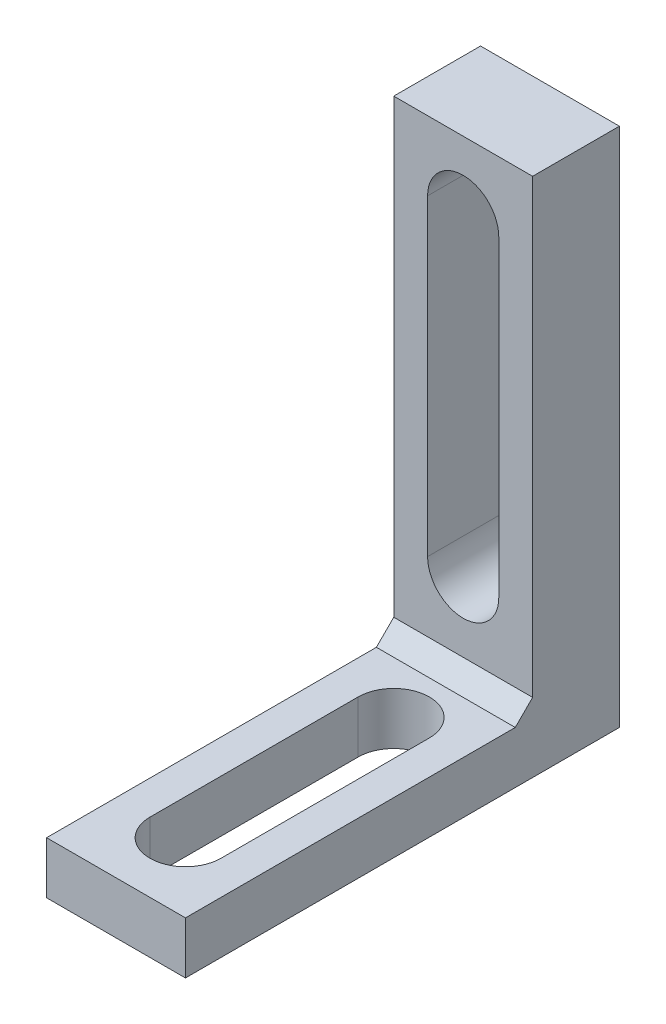
ISO-10303-21;
HEADER;
FILE_DESCRIPTION(('STEP AP214'),'2;1');
FILE_NAME('part.step','',(''),(''),'','','');
FILE_SCHEMA(('AUTOMOTIVE_DESIGN { 1 0 10303 214 1 1 1 1 }'));
ENDSEC;
DATA;
#1=APPLICATION_CONTEXT('core data for automotive mechanical design processes');
#2=APPLICATION_PROTOCOL_DEFINITION('international standard','automotive_design',2000,#1);
#3=PRODUCT_CONTEXT('',#1,'mechanical');
#4=PRODUCT('Part','Part','',(#3));
#5=PRODUCT_RELATED_PRODUCT_CATEGORY('part','',(#4));
#6=PRODUCT_DEFINITION_FORMATION('','',#4);
#7=PRODUCT_DEFINITION_CONTEXT('part definition',#1,'design');
#8=PRODUCT_DEFINITION('design','',#6,#7);
#9=PRODUCT_DEFINITION_SHAPE('','',#8);
#10=(LENGTH_UNIT() NAMED_UNIT(*) SI_UNIT(.MILLI.,.METRE.));
#11=(NAMED_UNIT(*) PLANE_ANGLE_UNIT() SI_UNIT($,.RADIAN.));
#12=(NAMED_UNIT(*) SI_UNIT($,.STERADIAN.) SOLID_ANGLE_UNIT());
#13=UNCERTAINTY_MEASURE_WITH_UNIT(LENGTH_MEASURE(1.E-05),#10,'distance_accuracy_value','');
#14=(GEOMETRIC_REPRESENTATION_CONTEXT(3) GLOBAL_UNCERTAINTY_ASSIGNED_CONTEXT((#13)) GLOBAL_UNIT_ASSIGNED_CONTEXT((#10,
#11,#12)) REPRESENTATION_CONTEXT('',''));
#15=CARTESIAN_POINT('',(0.,0.,0.));
#16=DIRECTION('',(0.,0.,1.));
#17=DIRECTION('',(1.,0.,0.));
#18=AXIS2_PLACEMENT_3D('',#15,#16,#17);
#19=CARTESIAN_POINT('',(8.,3.,0.));
#20=DIRECTION('',(0.,0.,-1.));
#21=DIRECTION('',(-1.,0.,0.));
#22=AXIS2_PLACEMENT_3D('',#19,#20,#21);
#23=PLANE('',#22);
#24=DIRECTION('',(0.,-1.,0.));
#25=VECTOR('',#24,1.);
#26=CARTESIAN_POINT('',(0.,3.,0.));
#27=LINE('',#26,#25);
#28=CARTESIAN_POINT('',(0.,3.,0.));
#29=VERTEX_POINT('',#28);
#30=CARTESIAN_POINT('',(0.,0.,0.));
#31=VERTEX_POINT('',#30);
#32=EDGE_CURVE('E217',#29,#31,#27,.T.);
#33=ORIENTED_EDGE('',*,*,#32,.T.);
#34=DIRECTION('',(-1.,0.,0.));
#35=VECTOR('',#34,1.);
#36=CARTESIAN_POINT('',(8.,0.,0.));
#37=LINE('',#36,#35);
#38=CARTESIAN_POINT('',(8.,0.,0.));
#39=VERTEX_POINT('',#38);
#40=EDGE_CURVE('E255',#39,#31,#37,.T.);
#41=ORIENTED_EDGE('',*,*,#40,.F.);
#42=DIRECTION('',(0.,-1.,0.));
#43=VECTOR('',#42,1.);
#44=CARTESIAN_POINT('',(8.,3.,0.));
#45=LINE('',#44,#43);
#46=CARTESIAN_POINT('',(8.,3.,0.));
#47=VERTEX_POINT('',#46);
#48=EDGE_CURVE('E218',#47,#39,#45,.T.);
#49=ORIENTED_EDGE('',*,*,#48,.F.);
#50=DIRECTION('',(-1.,0.,0.));
#51=VECTOR('',#50,1.);
#52=CARTESIAN_POINT('',(8.,3.,0.));
#53=LINE('',#52,#51);
#54=EDGE_CURVE('E232',#47,#29,#53,.T.);
#55=ORIENTED_EDGE('',*,*,#54,.T.);
#56=EDGE_LOOP('',(#33,#41,#49,#55));
#57=FACE_BOUND('',#56,.T.);
#58=ADVANCED_FACE('F34',(#57),#23,.F.);
#59=CARTESIAN_POINT('',(8.,0.,0.));
#60=DIRECTION('',(0.,1.,0.));
#61=DIRECTION('',(0.,0.,1.));
#62=AXIS2_PLACEMENT_3D('',#59,#60,#61);
#63=PLANE('',#62);
#64=DIRECTION('',(0.,0.,1.));
#65=VECTOR('',#64,1.);
#66=CARTESIAN_POINT('',(1.95,0.,0.));
#67=LINE('',#66,#65);
#68=CARTESIAN_POINT('',(1.95,0.,-16.));
#69=VERTEX_POINT('',#68);
#70=CARTESIAN_POINT('',(1.95,0.,-4.));
#71=VERTEX_POINT('',#70);
#72=EDGE_CURVE('E211',#69,#71,#67,.T.);
#73=ORIENTED_EDGE('',*,*,#72,.T.);
#74=CARTESIAN_POINT('',(4.,0.,-4.));
#75=DIRECTION('',(0.,1.,0.));
#76=DIRECTION('',(0.,0.,1.));
#77=AXIS2_PLACEMENT_3D('',#74,#75,#76);
#78=CIRCLE('',#77,2.05);
#79=CARTESIAN_POINT('',(6.05,0.,-4.));
#80=VERTEX_POINT('',#79);
#81=EDGE_CURVE('E214',#71,#80,#78,.T.);
#82=ORIENTED_EDGE('',*,*,#81,.T.);
#83=DIRECTION('',(0.,0.,-1.));
#84=VECTOR('',#83,1.);
#85=CARTESIAN_POINT('',(6.05,0.,0.));
#86=LINE('',#85,#84);
#87=CARTESIAN_POINT('',(6.05,0.,-16.));
#88=VERTEX_POINT('',#87);
#89=EDGE_CURVE('E199',#80,#88,#86,.T.);
#90=ORIENTED_EDGE('',*,*,#89,.T.);
#91=CARTESIAN_POINT('',(4.,0.,-16.));
#92=DIRECTION('',(0.,1.,0.));
#93=DIRECTION('',(0.,0.,1.));
#94=AXIS2_PLACEMENT_3D('',#91,#92,#93);
#95=CIRCLE('',#94,2.05);
#96=EDGE_CURVE('E208',#88,#69,#95,.T.);
#97=ORIENTED_EDGE('',*,*,#96,.T.);
#98=EDGE_LOOP('',(#73,#82,#90,#97));
#99=FACE_BOUND('',#98,.T.);
#100=DIRECTION('',(0.,0.,-1.));
#101=VECTOR('',#100,1.);
#102=CARTESIAN_POINT('',(0.,0.,0.));
#103=LINE('',#102,#101);
#104=CARTESIAN_POINT('',(0.,0.,-25.));
#105=VERTEX_POINT('',#104);
#106=EDGE_CURVE('E235',#31,#105,#103,.T.);
#107=ORIENTED_EDGE('',*,*,#106,.T.);
#108=DIRECTION('',(-1.,0.,0.));
#109=VECTOR('',#108,1.);
#110=CARTESIAN_POINT('',(8.,0.,-25.));
#111=LINE('',#110,#109);
#112=CARTESIAN_POINT('',(8.,0.,-25.));
#113=VERTEX_POINT('',#112);
#114=EDGE_CURVE('E252',#113,#105,#111,.T.);
#115=ORIENTED_EDGE('',*,*,#114,.F.);
#116=DIRECTION('',(0.,0.,-1.));
#117=VECTOR('',#116,1.);
#118=CARTESIAN_POINT('',(8.,0.,0.));
#119=LINE('',#118,#117);
#120=EDGE_CURVE('E221',#39,#113,#119,.T.);
#121=ORIENTED_EDGE('',*,*,#120,.F.);
#122=ORIENTED_EDGE('',*,*,#40,.T.);
#123=EDGE_LOOP('',(#107,#115,#121,#122));
#124=FACE_BOUND('',#123,.T.);
#125=ADVANCED_FACE('F283',(#99,#124),#63,.F.);
#126=CARTESIAN_POINT('',(8.,0.,-25.));
#127=DIRECTION('',(0.,0.,1.));
#128=DIRECTION('',(1.,0.,0.));
#129=AXIS2_PLACEMENT_3D('',#126,#127,#128);
#130=PLANE('',#129);
#131=DIRECTION('',(0.,1.,0.));
#132=VECTOR('',#131,1.);
#133=CARTESIAN_POINT('',(6.05,0.,-25.));
#134=LINE('',#133,#132);
#135=CARTESIAN_POINT('',(6.05,8.,-25.));
#136=VERTEX_POINT('',#135);
#137=CARTESIAN_POINT('',(6.05,26.,-25.));
#138=VERTEX_POINT('',#137);
#139=EDGE_CURVE('E179',#136,#138,#134,.T.);
#140=ORIENTED_EDGE('',*,*,#139,.T.);
#141=CARTESIAN_POINT('',(4.,26.,-25.));
#142=DIRECTION('',(0.,0.,1.));
#143=DIRECTION('',(1.,0.,0.));
#144=AXIS2_PLACEMENT_3D('',#141,#142,#143);
#145=CIRCLE('',#144,2.05);
#146=CARTESIAN_POINT('',(1.95,26.,-25.));
#147=VERTEX_POINT('',#146);
#148=EDGE_CURVE('E182',#138,#147,#145,.T.);
#149=ORIENTED_EDGE('',*,*,#148,.T.);
#150=DIRECTION('',(0.,-1.,0.));
#151=VECTOR('',#150,1.);
#152=CARTESIAN_POINT('',(1.95000000000001,0.,-25.));
#153=LINE('',#152,#151);
#154=CARTESIAN_POINT('',(1.95,8.,-25.));
#155=VERTEX_POINT('',#154);
#156=EDGE_CURVE('E174',#147,#155,#153,.T.);
#157=ORIENTED_EDGE('',*,*,#156,.T.);
#158=CARTESIAN_POINT('',(4.,8.,-25.));
#159=DIRECTION('',(0.,0.,1.));
#160=DIRECTION('',(1.,0.,0.));
#161=AXIS2_PLACEMENT_3D('',#158,#159,#160);
#162=CIRCLE('',#161,2.05);
#163=EDGE_CURVE('E150',#155,#136,#162,.T.);
#164=ORIENTED_EDGE('',*,*,#163,.T.);
#165=EDGE_LOOP('',(#140,#149,#157,#164));
#166=FACE_BOUND('',#165,.T.);
#167=DIRECTION('',(0.,1.,0.));
#168=VECTOR('',#167,1.);
#169=CARTESIAN_POINT('',(0.,0.,-25.));
#170=LINE('',#169,#168);
#171=CARTESIAN_POINT('',(0.,30.,-25.));
#172=VERTEX_POINT('',#171);
#173=EDGE_CURVE('E237',#105,#172,#170,.T.);
#174=ORIENTED_EDGE('',*,*,#173,.T.);
#175=DIRECTION('',(-1.,0.,0.));
#176=VECTOR('',#175,1.);
#177=CARTESIAN_POINT('',(8.,30.,-25.));
#178=LINE('',#177,#176);
#179=CARTESIAN_POINT('',(8.,30.,-25.));
#180=VERTEX_POINT('',#179);
#181=EDGE_CURVE('E249',#180,#172,#178,.T.);
#182=ORIENTED_EDGE('',*,*,#181,.F.);
#183=DIRECTION('',(0.,1.,0.));
#184=VECTOR('',#183,1.);
#185=CARTESIAN_POINT('',(8.,0.,-25.));
#186=LINE('',#185,#184);
#187=EDGE_CURVE('E224',#113,#180,#186,.T.);
#188=ORIENTED_EDGE('',*,*,#187,.F.);
#189=ORIENTED_EDGE('',*,*,#114,.T.);
#190=EDGE_LOOP('',(#174,#182,#188,#189));
#191=FACE_BOUND('',#190,.T.);
#192=ADVANCED_FACE('F287',(#166,#191),#130,.F.);
#193=CARTESIAN_POINT('',(8.,30.,-25.));
#194=DIRECTION('',(0.,-1.,0.));
#195=DIRECTION('',(0.,0.,-1.));
#196=AXIS2_PLACEMENT_3D('',#193,#194,#195);
#197=PLANE('',#196);
#198=DIRECTION('',(0.,0.,1.));
#199=VECTOR('',#198,1.);
#200=CARTESIAN_POINT('',(0.,30.,-25.));
#201=LINE('',#200,#199);
#202=CARTESIAN_POINT('',(0.,30.,-20.));
#203=VERTEX_POINT('',#202);
#204=EDGE_CURVE('E239',#172,#203,#201,.T.);
#205=ORIENTED_EDGE('',*,*,#204,.T.);
#206=DIRECTION('',(-1.,0.,0.));
#207=VECTOR('',#206,1.);
#208=CARTESIAN_POINT('',(8.,30.,-20.));
#209=LINE('',#208,#207);
#210=CARTESIAN_POINT('',(8.,30.,-20.));
#211=VERTEX_POINT('',#210);
#212=EDGE_CURVE('E246',#211,#203,#209,.T.);
#213=ORIENTED_EDGE('',*,*,#212,.F.);
#214=DIRECTION('',(0.,0.,1.));
#215=VECTOR('',#214,1.);
#216=CARTESIAN_POINT('',(8.,30.,-25.));
#217=LINE('',#216,#215);
#218=EDGE_CURVE('E226',#180,#211,#217,.T.);
#219=ORIENTED_EDGE('',*,*,#218,.F.);
#220=ORIENTED_EDGE('',*,*,#181,.T.);
#221=EDGE_LOOP('',(#205,#213,#219,#220));
#222=FACE_BOUND('',#221,.T.);
#223=ADVANCED_FACE('F293',(#222),#197,.F.);
#224=CARTESIAN_POINT('',(8.,30.,-20.));
#225=DIRECTION('',(0.,0.,-1.));
#226=DIRECTION('',(0.,1.,0.));
#227=AXIS2_PLACEMENT_3D('',#224,#225,#226);
#228=PLANE('',#227);
#229=DIRECTION('',(0.,-1.,0.));
#230=VECTOR('',#229,1.);
#231=CARTESIAN_POINT('',(1.95,26.,-20.));
#232=LINE('',#231,#230);
#233=CARTESIAN_POINT('',(1.95,26.,-20.));
#234=VERTEX_POINT('',#233);
#235=CARTESIAN_POINT('',(1.95000000000001,8.,-20.));
#236=VERTEX_POINT('',#235);
#237=EDGE_CURVE('E158',#234,#236,#232,.T.);
#238=ORIENTED_EDGE('',*,*,#237,.F.);
#239=CARTESIAN_POINT('',(4.,26.,-20.));
#240=DIRECTION('',(0.,0.,1.));
#241=DIRECTION('',(1.,0.,0.));
#242=AXIS2_PLACEMENT_3D('',#239,#240,#241);
#243=CIRCLE('',#242,2.05);
#244=CARTESIAN_POINT('',(6.05,26.,-20.));
#245=VERTEX_POINT('',#244);
#246=EDGE_CURVE('E163',#245,#234,#243,.T.);
#247=ORIENTED_EDGE('',*,*,#246,.F.);
#248=DIRECTION('',(0.,1.,0.));
#249=VECTOR('',#248,1.);
#250=CARTESIAN_POINT('',(6.05,26.,-20.));
#251=LINE('',#250,#249);
#252=CARTESIAN_POINT('',(6.05,8.,-20.));
#253=VERTEX_POINT('',#252);
#254=EDGE_CURVE('E167',#253,#245,#251,.T.);
#255=ORIENTED_EDGE('',*,*,#254,.F.);
#256=CARTESIAN_POINT('',(4.,8.,-20.));
#257=DIRECTION('',(0.,0.,1.));
#258=DIRECTION('',(1.,0.,0.));
#259=AXIS2_PLACEMENT_3D('',#256,#257,#258);
#260=CIRCLE('',#259,2.05);
#261=EDGE_CURVE('E147',#236,#253,#260,.T.);
#262=ORIENTED_EDGE('',*,*,#261,.F.);
#263=EDGE_LOOP('',(#238,#247,#255,#262));
#264=FACE_BOUND('',#263,.T.);
#265=DIRECTION('',(0.,-1.,0.));
#266=VECTOR('',#265,1.);
#267=CARTESIAN_POINT('',(0.,30.,-20.));
#268=LINE('',#267,#266);
#269=CARTESIAN_POINT('',(0.,4.,-20.));
#270=VERTEX_POINT('',#269);
#271=EDGE_CURVE('E241',#203,#270,#268,.T.);
#272=ORIENTED_EDGE('',*,*,#271,.T.);
#273=DIRECTION('',(1.,0.,0.));
#274=VECTOR('',#273,1.);
#275=CARTESIAN_POINT('',(8.,4.,-20.));
#276=LINE('',#275,#274);
#277=CARTESIAN_POINT('',(8.,4.,-20.));
#278=VERTEX_POINT('',#277);
#279=EDGE_CURVE('E50',#270,#278,#276,.T.);
#280=ORIENTED_EDGE('',*,*,#279,.T.);
#281=DIRECTION('',(0.,-1.,0.));
#282=VECTOR('',#281,1.);
#283=CARTESIAN_POINT('',(8.,30.,-20.));
#284=LINE('',#283,#282);
#285=EDGE_CURVE('E228',#211,#278,#284,.T.);
#286=ORIENTED_EDGE('',*,*,#285,.F.);
#287=ORIENTED_EDGE('',*,*,#212,.T.);
#288=EDGE_LOOP('',(#272,#280,#286,#287));
#289=FACE_BOUND('',#288,.T.);
#290=ADVANCED_FACE('F165',(#264,#289),#228,.F.);
#291=CARTESIAN_POINT('',(8.,3.,-20.));
#292=DIRECTION('',(0.,-1.,0.));
#293=DIRECTION('',(0.,0.,-1.));
#294=AXIS2_PLACEMENT_3D('',#291,#292,#293);
#295=PLANE('',#294);
#296=DIRECTION('',(0.,0.,-1.));
#297=VECTOR('',#296,1.);
#298=CARTESIAN_POINT('',(6.05,3.,-4.));
#299=LINE('',#298,#297);
#300=CARTESIAN_POINT('',(6.05,3.,-4.));
#301=VERTEX_POINT('',#300);
#302=CARTESIAN_POINT('',(6.05,3.,-16.));
#303=VERTEX_POINT('',#302);
#304=EDGE_CURVE('E187',#301,#303,#299,.T.);
#305=ORIENTED_EDGE('',*,*,#304,.F.);
#306=CARTESIAN_POINT('',(4.,3.,-4.));
#307=DIRECTION('',(0.,1.,0.));
#308=DIRECTION('',(0.,0.,1.));
#309=AXIS2_PLACEMENT_3D('',#306,#307,#308);
#310=CIRCLE('',#309,2.05);
#311=CARTESIAN_POINT('',(1.95,3.,-4.));
#312=VERTEX_POINT('',#311);
#313=EDGE_CURVE('E185',#312,#301,#310,.T.);
#314=ORIENTED_EDGE('',*,*,#313,.F.);
#315=DIRECTION('',(0.,0.,1.));
#316=VECTOR('',#315,1.);
#317=CARTESIAN_POINT('',(1.95,3.,-4.));
#318=LINE('',#317,#316);
#319=CARTESIAN_POINT('',(1.95,3.,-16.));
#320=VERTEX_POINT('',#319);
#321=EDGE_CURVE('E193',#320,#312,#318,.T.);
#322=ORIENTED_EDGE('',*,*,#321,.F.);
#323=CARTESIAN_POINT('',(4.,3.,-16.));
#324=DIRECTION('',(0.,1.,0.));
#325=DIRECTION('',(0.,0.,1.));
#326=AXIS2_PLACEMENT_3D('',#323,#324,#325);
#327=CIRCLE('',#326,2.05);
#328=EDGE_CURVE('E190',#303,#320,#327,.T.);
#329=ORIENTED_EDGE('',*,*,#328,.F.);
#330=EDGE_LOOP('',(#305,#314,#322,#329));
#331=FACE_BOUND('',#330,.T.);
#332=DIRECTION('',(0.,0.,1.));
#333=VECTOR('',#332,1.);
#334=CARTESIAN_POINT('',(8.,3.,-20.));
#335=LINE('',#334,#333);
#336=CARTESIAN_POINT('',(8.,3.,-19.));
#337=VERTEX_POINT('',#336);
#338=EDGE_CURVE('E230',#337,#47,#335,.T.);
#339=ORIENTED_EDGE('',*,*,#338,.F.);
#340=DIRECTION('',(-1.,0.,0.));
#341=VECTOR('',#340,1.);
#342=CARTESIAN_POINT('',(0.,3.,-19.));
#343=LINE('',#342,#341);
#344=CARTESIAN_POINT('',(0.,3.,-19.));
#345=VERTEX_POINT('',#344);
#346=EDGE_CURVE('E258',#337,#345,#343,.T.);
#347=ORIENTED_EDGE('',*,*,#346,.T.);
#348=DIRECTION('',(0.,0.,1.));
#349=VECTOR('',#348,1.);
#350=CARTESIAN_POINT('',(0.,3.,-20.));
#351=LINE('',#350,#349);
#352=EDGE_CURVE('E222',#345,#29,#351,.T.);
#353=ORIENTED_EDGE('',*,*,#352,.T.);
#354=ORIENTED_EDGE('',*,*,#54,.F.);
#355=EDGE_LOOP('',(#339,#347,#353,#354));
#356=FACE_BOUND('',#355,.T.);
#357=ADVANCED_FACE('F264',(#331,#356),#295,.F.);
#358=CARTESIAN_POINT('',(8.,0.,0.));
#359=DIRECTION('',(1.,0.,0.));
#360=DIRECTION('',(0.,0.,-1.));
#361=AXIS2_PLACEMENT_3D('',#358,#359,#360);
#362=PLANE('',#361);
#363=ORIENTED_EDGE('',*,*,#48,.T.);
#364=ORIENTED_EDGE('',*,*,#120,.T.);
#365=ORIENTED_EDGE('',*,*,#187,.T.);
#366=ORIENTED_EDGE('',*,*,#218,.T.);
#367=ORIENTED_EDGE('',*,*,#285,.T.);
#368=DIRECTION('',(0.,0.707106781186544,-0.707106781186551));
#369=VECTOR('',#368,1.);
#370=CARTESIAN_POINT('',(8.,3.,-19.));
#371=LINE('',#370,#369);
#372=EDGE_CURVE('E11',#278,#337,#371,.F.);
#373=ORIENTED_EDGE('',*,*,#372,.T.);
#374=ORIENTED_EDGE('',*,*,#338,.T.);
#375=EDGE_LOOP('',(#363,#364,#365,#366,#367,#373,#374));
#376=FACE_BOUND('',#375,.T.);
#377=ADVANCED_FACE('F275',(#376),#362,.T.);
#378=CARTESIAN_POINT('',(0.,0.,0.));
#379=DIRECTION('',(1.,0.,0.));
#380=DIRECTION('',(0.,0.,-1.));
#381=AXIS2_PLACEMENT_3D('',#378,#379,#380);
#382=PLANE('',#381);
#383=ORIENTED_EDGE('',*,*,#32,.F.);
#384=ORIENTED_EDGE('',*,*,#352,.F.);
#385=DIRECTION('',(0.,-0.707106781186544,0.707106781186551));
#386=VECTOR('',#385,1.);
#387=CARTESIAN_POINT('',(0.,-7.99999999999998,-7.9999999999999));
#388=LINE('',#387,#386);
#389=EDGE_CURVE('E43',#345,#270,#388,.F.);
#390=ORIENTED_EDGE('',*,*,#389,.T.);
#391=ORIENTED_EDGE('',*,*,#271,.F.);
#392=ORIENTED_EDGE('',*,*,#204,.F.);
#393=ORIENTED_EDGE('',*,*,#173,.F.);
#394=ORIENTED_EDGE('',*,*,#106,.F.);
#395=EDGE_LOOP('',(#383,#384,#390,#391,#392,#393,#394));
#396=FACE_BOUND('',#395,.T.);
#397=ADVANCED_FACE('F269',(#396),#382,.F.);
#398=CARTESIAN_POINT('',(4.,-5.,-4.));
#399=DIRECTION('',(0.,1.,0.));
#400=DIRECTION('',(0.,0.,1.));
#401=AXIS2_PLACEMENT_3D('',#398,#399,#400);
#402=CYLINDRICAL_SURFACE('',#401,2.05);
#403=DIRECTION('',(0.,1.,0.));
#404=VECTOR('',#403,1.);
#405=CARTESIAN_POINT('',(1.95,-5.,-4.));
#406=LINE('',#405,#404);
#407=EDGE_CURVE('E197',#71,#312,#406,.T.);
#408=ORIENTED_EDGE('',*,*,#407,.T.);
#409=ORIENTED_EDGE('',*,*,#313,.T.);
#410=DIRECTION('',(0.,1.,0.));
#411=VECTOR('',#410,1.);
#412=CARTESIAN_POINT('',(6.05,-5.,-4.));
#413=LINE('',#412,#411);
#414=EDGE_CURVE('E196',#80,#301,#413,.T.);
#415=ORIENTED_EDGE('',*,*,#414,.F.);
#416=ORIENTED_EDGE('',*,*,#81,.F.);
#417=EDGE_LOOP('',(#408,#409,#415,#416));
#418=FACE_BOUND('',#417,.T.);
#419=ADVANCED_FACE('F305',(#418),#402,.F.);
#420=CARTESIAN_POINT('',(1.95,-5.,-4.));
#421=DIRECTION('',(-1.,0.,0.));
#422=DIRECTION('',(0.,0.,1.));
#423=AXIS2_PLACEMENT_3D('',#420,#421,#422);
#424=PLANE('',#423);
#425=DIRECTION('',(0.,1.,0.));
#426=VECTOR('',#425,1.);
#427=CARTESIAN_POINT('',(1.95,-5.,-16.));
#428=LINE('',#427,#426);
#429=EDGE_CURVE('E200',#69,#320,#428,.T.);
#430=ORIENTED_EDGE('',*,*,#429,.T.);
#431=ORIENTED_EDGE('',*,*,#321,.T.);
#432=ORIENTED_EDGE('',*,*,#407,.F.);
#433=ORIENTED_EDGE('',*,*,#72,.F.);
#434=EDGE_LOOP('',(#430,#431,#432,#433));
#435=FACE_BOUND('',#434,.T.);
#436=ADVANCED_FACE('F310',(#435),#424,.F.);
#437=CARTESIAN_POINT('',(4.,-5.,-16.));
#438=DIRECTION('',(0.,1.,0.));
#439=DIRECTION('',(0.,0.,1.));
#440=AXIS2_PLACEMENT_3D('',#437,#438,#439);
#441=CYLINDRICAL_SURFACE('',#440,2.05);
#442=DIRECTION('',(0.,1.,0.));
#443=VECTOR('',#442,1.);
#444=CARTESIAN_POINT('',(6.05,-5.,-16.));
#445=LINE('',#444,#443);
#446=EDGE_CURVE('E202',#88,#303,#445,.T.);
#447=ORIENTED_EDGE('',*,*,#446,.T.);
#448=ORIENTED_EDGE('',*,*,#328,.T.);
#449=ORIENTED_EDGE('',*,*,#429,.F.);
#450=ORIENTED_EDGE('',*,*,#96,.F.);
#451=EDGE_LOOP('',(#447,#448,#449,#450));
#452=FACE_BOUND('',#451,.T.);
#453=ADVANCED_FACE('F316',(#452),#441,.F.);
#454=CARTESIAN_POINT('',(6.05,-5.,-4.));
#455=DIRECTION('',(1.,0.,0.));
#456=DIRECTION('',(0.,0.,-1.));
#457=AXIS2_PLACEMENT_3D('',#454,#455,#456);
#458=PLANE('',#457);
#459=ORIENTED_EDGE('',*,*,#414,.T.);
#460=ORIENTED_EDGE('',*,*,#304,.T.);
#461=ORIENTED_EDGE('',*,*,#446,.F.);
#462=ORIENTED_EDGE('',*,*,#89,.F.);
#463=EDGE_LOOP('',(#459,#460,#461,#462));
#464=FACE_BOUND('',#463,.T.);
#465=ADVANCED_FACE('F312',(#464),#458,.F.);
#466=CARTESIAN_POINT('',(4.,26.,-28.));
#467=DIRECTION('',(0.,0.,1.));
#468=DIRECTION('',(1.,0.,0.));
#469=AXIS2_PLACEMENT_3D('',#466,#467,#468);
#470=CYLINDRICAL_SURFACE('',#469,2.05);
#471=DIRECTION('',(0.,0.,1.));
#472=VECTOR('',#471,1.);
#473=CARTESIAN_POINT('',(6.05,26.,-28.));
#474=LINE('',#473,#472);
#475=EDGE_CURVE('E172',#138,#245,#474,.T.);
#476=ORIENTED_EDGE('',*,*,#475,.T.);
#477=ORIENTED_EDGE('',*,*,#246,.T.);
#478=DIRECTION('',(0.,0.,1.));
#479=VECTOR('',#478,1.);
#480=CARTESIAN_POINT('',(1.95,26.,-28.));
#481=LINE('',#480,#479);
#482=EDGE_CURVE('E154',#147,#234,#481,.T.);
#483=ORIENTED_EDGE('',*,*,#482,.F.);
#484=ORIENTED_EDGE('',*,*,#148,.F.);
#485=EDGE_LOOP('',(#476,#477,#483,#484));
#486=FACE_BOUND('',#485,.T.);
#487=ADVANCED_FACE('F315',(#486),#470,.F.);
#488=CARTESIAN_POINT('',(6.05,26.,-28.));
#489=DIRECTION('',(1.,0.,0.));
#490=DIRECTION('',(0.,0.,-1.));
#491=AXIS2_PLACEMENT_3D('',#488,#489,#490);
#492=PLANE('',#491);
#493=DIRECTION('',(0.,0.,1.));
#494=VECTOR('',#493,1.);
#495=CARTESIAN_POINT('',(6.05,8.,-28.));
#496=LINE('',#495,#494);
#497=EDGE_CURVE('E153',#136,#253,#496,.T.);
#498=ORIENTED_EDGE('',*,*,#497,.T.);
#499=ORIENTED_EDGE('',*,*,#254,.T.);
#500=ORIENTED_EDGE('',*,*,#475,.F.);
#501=ORIENTED_EDGE('',*,*,#139,.F.);
#502=EDGE_LOOP('',(#498,#499,#500,#501));
#503=FACE_BOUND('',#502,.T.);
#504=ADVANCED_FACE('F325',(#503),#492,.F.);
#505=CARTESIAN_POINT('',(4.,8.,-28.));
#506=DIRECTION('',(0.,0.,1.));
#507=DIRECTION('',(1.,0.,0.));
#508=AXIS2_PLACEMENT_3D('',#505,#506,#507);
#509=CYLINDRICAL_SURFACE('',#508,2.05);
#510=DIRECTION('',(0.,0.,1.));
#511=VECTOR('',#510,1.);
#512=CARTESIAN_POINT('',(1.95000000000001,8.,-28.));
#513=LINE('',#512,#511);
#514=EDGE_CURVE('E142',#155,#236,#513,.T.);
#515=ORIENTED_EDGE('',*,*,#514,.T.);
#516=ORIENTED_EDGE('',*,*,#261,.T.);
#517=ORIENTED_EDGE('',*,*,#497,.F.);
#518=ORIENTED_EDGE('',*,*,#163,.F.);
#519=EDGE_LOOP('',(#515,#516,#517,#518));
#520=FACE_BOUND('',#519,.T.);
#521=ADVANCED_FACE('F144',(#520),#509,.F.);
#522=CARTESIAN_POINT('',(1.95,26.,-28.));
#523=DIRECTION('',(-1.,0.,0.));
#524=DIRECTION('',(0.,-1.,0.));
#525=AXIS2_PLACEMENT_3D('',#522,#523,#524);
#526=PLANE('',#525);
#527=ORIENTED_EDGE('',*,*,#482,.T.);
#528=ORIENTED_EDGE('',*,*,#237,.T.);
#529=ORIENTED_EDGE('',*,*,#514,.F.);
#530=ORIENTED_EDGE('',*,*,#156,.F.);
#531=EDGE_LOOP('',(#527,#528,#529,#530));
#532=FACE_BOUND('',#531,.T.);
#533=ADVANCED_FACE('F159',(#532),#526,.F.);
#534=CARTESIAN_POINT('',(8.,3.,-19.));
#535=DIRECTION('',(0.,0.707106781186551,0.707106781186544));
#536=DIRECTION('',(1.,0.,0.));
#537=AXIS2_PLACEMENT_3D('',#534,#535,#536);
#538=PLANE('',#537);
#539=ORIENTED_EDGE('',*,*,#372,.F.);
#540=ORIENTED_EDGE('',*,*,#279,.F.);
#541=ORIENTED_EDGE('',*,*,#389,.F.);
#542=ORIENTED_EDGE('',*,*,#346,.F.);
#543=EDGE_LOOP('',(#539,#540,#541,#542));
#544=FACE_BOUND('',#543,.T.);
#545=ADVANCED_FACE('F37',(#544),#538,.T.);
#546=CLOSED_SHELL('',(#58,#125,#192,#223,#290,#357,#377,#397,#419,#436,#453,#465,#487,#504,#521,
#533,#545));
#547=MANIFOLD_SOLID_BREP('B2',#546);
#548=ADVANCED_BREP_SHAPE_REPRESENTATION('',(#18,#547),#14);
#549=SHAPE_DEFINITION_REPRESENTATION(#9,#548);
ENDSEC;
END-ISO-10303-21;
